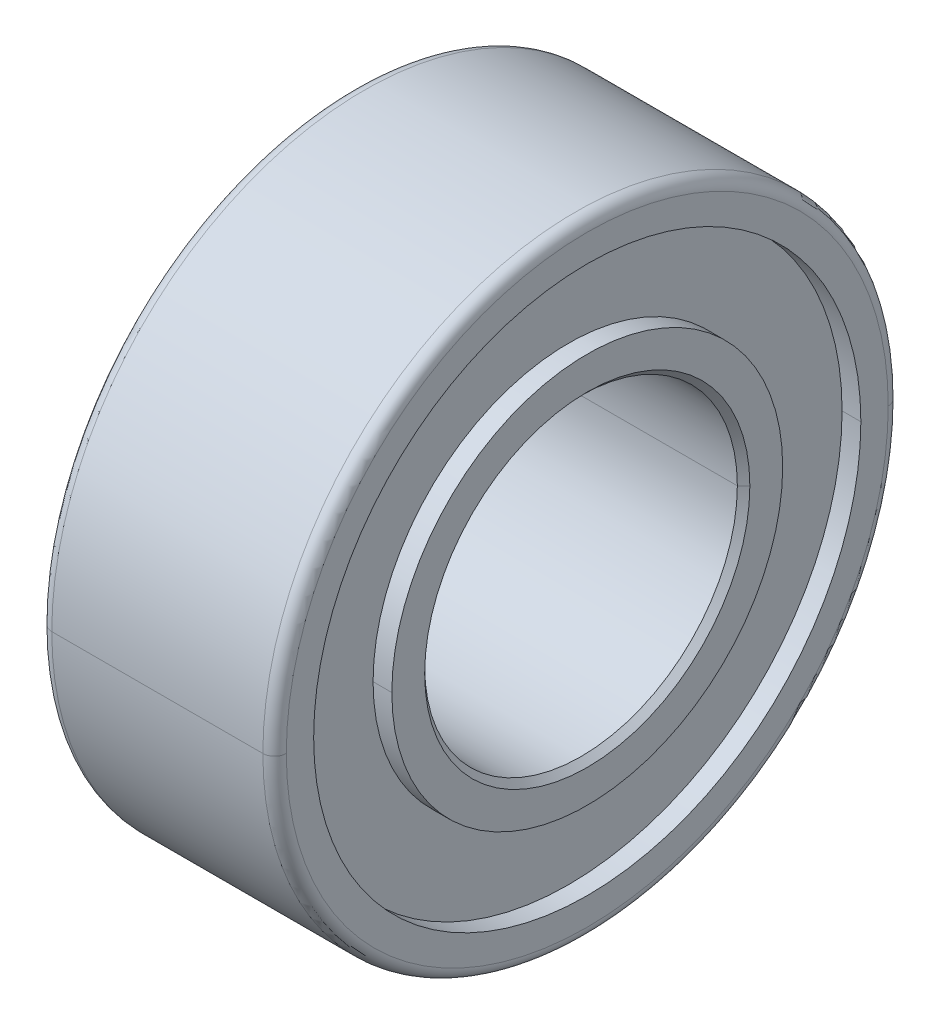
ISO-10303-21;
HEADER;
FILE_DESCRIPTION(('STEP AP214'),'2;1');
FILE_NAME('part.step','',(''),(''),'','','');
FILE_SCHEMA(('AUTOMOTIVE_DESIGN { 1 0 10303 214 1 1 1 1 }'));
ENDSEC;
DATA;
#1=APPLICATION_CONTEXT('core data for automotive mechanical design processes');
#2=APPLICATION_PROTOCOL_DEFINITION('international standard','automotive_design',2000,#1);
#3=PRODUCT_CONTEXT('',#1,'mechanical');
#4=PRODUCT('Part','Part','',(#3));
#5=PRODUCT_RELATED_PRODUCT_CATEGORY('part','',(#4));
#6=PRODUCT_DEFINITION_FORMATION('','',#4);
#7=PRODUCT_DEFINITION_CONTEXT('part definition',#1,'design');
#8=PRODUCT_DEFINITION('design','',#6,#7);
#9=PRODUCT_DEFINITION_SHAPE('','',#8);
#10=(LENGTH_UNIT() NAMED_UNIT(*) SI_UNIT(.MILLI.,.METRE.));
#11=(NAMED_UNIT(*) PLANE_ANGLE_UNIT() SI_UNIT($,.RADIAN.));
#12=(NAMED_UNIT(*) SI_UNIT($,.STERADIAN.) SOLID_ANGLE_UNIT());
#13=UNCERTAINTY_MEASURE_WITH_UNIT(LENGTH_MEASURE(1.E-05),#10,'distance_accuracy_value','');
#14=(GEOMETRIC_REPRESENTATION_CONTEXT(3) GLOBAL_UNCERTAINTY_ASSIGNED_CONTEXT((#13)) GLOBAL_UNIT_ASSIGNED_CONTEXT((#10,
#11,#12)) REPRESENTATION_CONTEXT('',''));
#15=CARTESIAN_POINT('',(0.,0.,0.));
#16=DIRECTION('',(0.,0.,1.));
#17=DIRECTION('',(1.,0.,0.));
#18=AXIS2_PLACEMENT_3D('',#15,#16,#17);
#19=CARTESIAN_POINT('',(2.38125,0.,0.));
#20=DIRECTION('',(1.,0.,0.));
#21=DIRECTION('',(0.,0.,-1.));
#22=AXIS2_PLACEMENT_3D('',#19,#20,#21);
#23=CONICAL_SURFACE('',#22,3.302,0.785398163397445);
#24=DIRECTION('',(0.70710678118655,0.,0.707106781186545));
#25=VECTOR('',#24,1.);
#26=CARTESIAN_POINT('',(2.38125,0.,3.302));
#27=LINE('',#26,#25);
#28=CARTESIAN_POINT('',(2.25425,0.,3.175));
#29=VERTEX_POINT('',#28);
#30=CARTESIAN_POINT('',(2.38125,0.,3.302));
#31=VERTEX_POINT('',#30);
#32=EDGE_CURVE('E371',#29,#31,#27,.T.);
#33=ORIENTED_EDGE('',*,*,#32,.F.);
#34=CARTESIAN_POINT('',(2.25425,0.,0.));
#35=DIRECTION('',(1.,0.,0.));
#36=DIRECTION('',(0.,0.,1.));
#37=AXIS2_PLACEMENT_3D('',#34,#35,#36);
#38=CIRCLE('',#37,3.175);
#39=CARTESIAN_POINT('',(2.25425,0.,-3.175));
#40=VERTEX_POINT('',#39);
#41=EDGE_CURVE('E183',#40,#29,#38,.T.);
#42=ORIENTED_EDGE('',*,*,#41,.F.);
#43=DIRECTION('',(0.70710678118655,0.,-0.707106781186545));
#44=VECTOR('',#43,1.);
#45=CARTESIAN_POINT('',(2.38125,0.,-3.302));
#46=LINE('',#45,#44);
#47=CARTESIAN_POINT('',(2.38125,0.,-3.302));
#48=VERTEX_POINT('',#47);
#49=EDGE_CURVE('E360',#40,#48,#46,.T.);
#50=ORIENTED_EDGE('',*,*,#49,.T.);
#51=CARTESIAN_POINT('',(2.38125,0.,0.));
#52=DIRECTION('',(-1.,0.,0.));
#53=DIRECTION('',(0.,0.,1.));
#54=AXIS2_PLACEMENT_3D('',#51,#52,#53);
#55=CIRCLE('',#54,3.302);
#56=EDGE_CURVE('E143',#31,#48,#55,.T.);
#57=ORIENTED_EDGE('',*,*,#56,.F.);
#58=EDGE_LOOP('',(#33,#42,#50,#57));
#59=FACE_BOUND('',#58,.T.);
#60=ADVANCED_FACE('F16',(#59),#23,.F.);
#61=CARTESIAN_POINT('',(-2.25425,0.,0.));
#62=DIRECTION('',(-1.,0.,0.));
#63=DIRECTION('',(0.,0.,1.));
#64=AXIS2_PLACEMENT_3D('',#61,#62,#63);
#65=CONICAL_SURFACE('',#64,3.175,0.785398163397446);
#66=DIRECTION('',(-0.707106781186549,0.,-0.707106781186546));
#67=VECTOR('',#66,1.);
#68=CARTESIAN_POINT('',(-2.25425,0.,-3.175));
#69=LINE('',#68,#67);
#70=CARTESIAN_POINT('',(-2.25425,0.,-3.175));
#71=VERTEX_POINT('',#70);
#72=CARTESIAN_POINT('',(-2.38125,0.,-3.302));
#73=VERTEX_POINT('',#72);
#74=EDGE_CURVE('E350',#71,#73,#69,.T.);
#75=ORIENTED_EDGE('',*,*,#74,.F.);
#76=CARTESIAN_POINT('',(-2.25425,0.,0.));
#77=DIRECTION('',(-1.,0.,0.));
#78=DIRECTION('',(0.,0.,-1.));
#79=AXIS2_PLACEMENT_3D('',#76,#77,#78);
#80=CIRCLE('',#79,3.175);
#81=CARTESIAN_POINT('',(-2.25425,0.,3.175));
#82=VERTEX_POINT('',#81);
#83=EDGE_CURVE('E144',#82,#71,#80,.T.);
#84=ORIENTED_EDGE('',*,*,#83,.F.);
#85=DIRECTION('',(-0.707106781186549,0.,0.707106781186546));
#86=VECTOR('',#85,1.);
#87=CARTESIAN_POINT('',(-2.25425,0.,3.175));
#88=LINE('',#87,#86);
#89=CARTESIAN_POINT('',(-2.38125,0.,3.302));
#90=VERTEX_POINT('',#89);
#91=EDGE_CURVE('E311',#82,#90,#88,.T.);
#92=ORIENTED_EDGE('',*,*,#91,.T.);
#93=CARTESIAN_POINT('',(-2.38125,0.,0.));
#94=DIRECTION('',(1.,0.,0.));
#95=DIRECTION('',(0.,0.,-1.));
#96=AXIS2_PLACEMENT_3D('',#93,#94,#95);
#97=CIRCLE('',#96,3.302);
#98=EDGE_CURVE('E187',#73,#90,#97,.T.);
#99=ORIENTED_EDGE('',*,*,#98,.F.);
#100=EDGE_LOOP('',(#75,#84,#92,#99));
#101=FACE_BOUND('',#100,.T.);
#102=ADVANCED_FACE('F443',(#101),#65,.F.);
#103=CARTESIAN_POINT('',(2.143125,0.,0.));
#104=DIRECTION('',(-1.,0.,0.));
#105=DIRECTION('',(0.,0.,1.));
#106=AXIS2_PLACEMENT_3D('',#103,#104,#105);
#107=TOROIDAL_SURFACE('',#106,6.111875,0.238125);
#108=CARTESIAN_POINT('',(2.143125,0.,-6.111875));
#109=DIRECTION('',(0.,1.,0.));
#110=DIRECTION('',(0.,0.,1.));
#111=AXIS2_PLACEMENT_3D('',#108,#109,#110);
#112=CIRCLE('',#111,0.238125);
#113=CARTESIAN_POINT('',(2.38125,0.,-6.111875));
#114=VERTEX_POINT('',#113);
#115=CARTESIAN_POINT('',(2.143125,0.,-6.35));
#116=VERTEX_POINT('',#115);
#117=EDGE_CURVE('E300',#114,#116,#112,.T.);
#118=ORIENTED_EDGE('',*,*,#117,.F.);
#119=CARTESIAN_POINT('',(2.38125,0.,0.));
#120=DIRECTION('',(1.,0.,0.));
#121=DIRECTION('',(0.,0.,1.));
#122=AXIS2_PLACEMENT_3D('',#119,#120,#121);
#123=CIRCLE('',#122,6.111875);
#124=CARTESIAN_POINT('',(2.38125,0.,6.111875));
#125=VERTEX_POINT('',#124);
#126=EDGE_CURVE('E197',#125,#114,#123,.T.);
#127=ORIENTED_EDGE('',*,*,#126,.F.);
#128=CARTESIAN_POINT('',(2.143125,0.,6.111875));
#129=DIRECTION('',(0.,-1.,0.));
#130=DIRECTION('',(0.,0.,-1.));
#131=AXIS2_PLACEMENT_3D('',#128,#129,#130);
#132=CIRCLE('',#131,0.238125);
#133=CARTESIAN_POINT('',(2.143125,0.,6.35));
#134=VERTEX_POINT('',#133);
#135=EDGE_CURVE('E309',#125,#134,#132,.T.);
#136=ORIENTED_EDGE('',*,*,#135,.T.);
#137=CARTESIAN_POINT('',(2.143125,0.,0.));
#138=DIRECTION('',(-1.,0.,0.));
#139=DIRECTION('',(0.,0.,1.));
#140=AXIS2_PLACEMENT_3D('',#137,#138,#139);
#141=CIRCLE('',#140,6.35);
#142=EDGE_CURVE('E201',#116,#134,#141,.T.);
#143=ORIENTED_EDGE('',*,*,#142,.F.);
#144=EDGE_LOOP('',(#118,#127,#136,#143));
#145=FACE_BOUND('',#144,.T.);
#146=ADVANCED_FACE('F301',(#145),#107,.T.);
#147=CARTESIAN_POINT('',(-2.143125,0.,0.));
#148=DIRECTION('',(1.,0.,0.));
#149=DIRECTION('',(0.,0.,-1.));
#150=AXIS2_PLACEMENT_3D('',#147,#148,#149);
#151=TOROIDAL_SURFACE('',#150,6.111875,0.238125);
#152=CARTESIAN_POINT('',(-2.143125,0.,6.111875));
#153=DIRECTION('',(0.,1.,0.));
#154=DIRECTION('',(0.,0.,1.));
#155=AXIS2_PLACEMENT_3D('',#152,#153,#154);
#156=CIRCLE('',#155,0.238125);
#157=CARTESIAN_POINT('',(-2.38125,0.,6.111875));
#158=VERTEX_POINT('',#157);
#159=CARTESIAN_POINT('',(-2.143125,0.,6.35));
#160=VERTEX_POINT('',#159);
#161=EDGE_CURVE('E325',#158,#160,#156,.T.);
#162=ORIENTED_EDGE('',*,*,#161,.F.);
#163=CARTESIAN_POINT('',(-2.38125,0.,0.));
#164=DIRECTION('',(-1.,0.,0.));
#165=DIRECTION('',(0.,0.,-1.));
#166=AXIS2_PLACEMENT_3D('',#163,#164,#165);
#167=CIRCLE('',#166,6.111875);
#168=CARTESIAN_POINT('',(-2.38125,0.,-6.111875));
#169=VERTEX_POINT('',#168);
#170=EDGE_CURVE('E207',#169,#158,#167,.T.);
#171=ORIENTED_EDGE('',*,*,#170,.F.);
#172=CARTESIAN_POINT('',(-2.143125,0.,-6.111875));
#173=DIRECTION('',(0.,-1.,0.));
#174=DIRECTION('',(0.,0.,-1.));
#175=AXIS2_PLACEMENT_3D('',#172,#173,#174);
#176=CIRCLE('',#175,0.238125);
#177=CARTESIAN_POINT('',(-2.143125,0.,-6.35));
#178=VERTEX_POINT('',#177);
#179=EDGE_CURVE('E324',#169,#178,#176,.T.);
#180=ORIENTED_EDGE('',*,*,#179,.T.);
#181=CARTESIAN_POINT('',(-2.143125,0.,0.));
#182=DIRECTION('',(1.,0.,0.));
#183=DIRECTION('',(0.,0.,-1.));
#184=AXIS2_PLACEMENT_3D('',#181,#182,#183);
#185=CIRCLE('',#184,6.35);
#186=EDGE_CURVE('E204',#160,#178,#185,.T.);
#187=ORIENTED_EDGE('',*,*,#186,.F.);
#188=EDGE_LOOP('',(#162,#171,#180,#187));
#189=FACE_BOUND('',#188,.T.);
#190=ADVANCED_FACE('F465',(#189),#151,.T.);
#191=CARTESIAN_POINT('',(0.,0.,0.));
#192=DIRECTION('',(-1.,0.,0.));
#193=DIRECTION('',(0.,0.,1.));
#194=AXIS2_PLACEMENT_3D('',#191,#192,#193);
#195=CYLINDRICAL_SURFACE('',#194,3.96875);
#196=DIRECTION('',(-1.,0.,0.));
#197=VECTOR('',#196,1.);
#198=CARTESIAN_POINT('',(0.,0.,-3.96875));
#199=LINE('',#198,#197);
#200=CARTESIAN_POINT('',(-2.00025,0.,-3.96875));
#201=VERTEX_POINT('',#200);
#202=CARTESIAN_POINT('',(-2.38125,0.,-3.96875));
#203=VERTEX_POINT('',#202);
#204=EDGE_CURVE('E329',#201,#203,#199,.T.);
#205=ORIENTED_EDGE('',*,*,#204,.F.);
#206=CARTESIAN_POINT('',(-2.00025,0.,0.));
#207=DIRECTION('',(-1.,0.,0.));
#208=DIRECTION('',(0.,0.,1.));
#209=AXIS2_PLACEMENT_3D('',#206,#207,#208);
#210=CIRCLE('',#209,3.96875);
#211=CARTESIAN_POINT('',(-2.00025,0.,3.96875));
#212=VERTEX_POINT('',#211);
#213=EDGE_CURVE('E11',#201,#212,#210,.T.);
#214=ORIENTED_EDGE('',*,*,#213,.T.);
#215=DIRECTION('',(-1.,0.,0.));
#216=VECTOR('',#215,1.);
#217=CARTESIAN_POINT('',(0.,0.,3.96875));
#218=LINE('',#217,#216);
#219=CARTESIAN_POINT('',(-2.38125,0.,3.96875));
#220=VERTEX_POINT('',#219);
#221=EDGE_CURVE('E236',#212,#220,#218,.T.);
#222=ORIENTED_EDGE('',*,*,#221,.T.);
#223=CARTESIAN_POINT('',(-2.38125,0.,0.));
#224=DIRECTION('',(-1.,0.,0.));
#225=DIRECTION('',(0.,0.,1.));
#226=AXIS2_PLACEMENT_3D('',#223,#224,#225);
#227=CIRCLE('',#226,3.96875);
#228=EDGE_CURVE('E182',#203,#220,#227,.T.);
#229=ORIENTED_EDGE('',*,*,#228,.F.);
#230=EDGE_LOOP('',(#205,#214,#222,#229));
#231=FACE_BOUND('',#230,.T.);
#232=ADVANCED_FACE('F455',(#231),#195,.T.);
#233=CARTESIAN_POINT('',(-2.00025,5.55625,0.));
#234=DIRECTION('',(1.,0.,0.));
#235=DIRECTION('',(0.,1.,0.));
#236=AXIS2_PLACEMENT_3D('',#233,#234,#235);
#237=PLANE('',#236);
#238=CARTESIAN_POINT('',(-2.00025,0.,0.));
#239=DIRECTION('',(-1.,0.,0.));
#240=DIRECTION('',(0.,0.,1.));
#241=AXIS2_PLACEMENT_3D('',#238,#239,#240);
#242=CIRCLE('',#241,3.96875);
#243=EDGE_CURVE('E326',#212,#201,#242,.T.);
#244=ORIENTED_EDGE('',*,*,#243,.F.);
#245=ORIENTED_EDGE('',*,*,#213,.F.);
#246=EDGE_LOOP('',(#244,#245));
#247=FACE_BOUND('',#246,.T.);
#248=CARTESIAN_POINT('',(-2.00025,0.,0.));
#249=DIRECTION('',(-1.,0.,0.));
#250=DIRECTION('',(0.,0.,1.));
#251=AXIS2_PLACEMENT_3D('',#248,#249,#250);
#252=CIRCLE('',#251,5.55625);
#253=CARTESIAN_POINT('',(-2.00025,0.,5.55625));
#254=VERTEX_POINT('',#253);
#255=CARTESIAN_POINT('',(-2.00025,0.,-5.55625));
#256=VERTEX_POINT('',#255);
#257=EDGE_CURVE('E25',#254,#256,#252,.T.);
#258=ORIENTED_EDGE('',*,*,#257,.T.);
#259=CARTESIAN_POINT('',(-2.00025,0.,0.));
#260=DIRECTION('',(-1.,0.,0.));
#261=DIRECTION('',(0.,0.,1.));
#262=AXIS2_PLACEMENT_3D('',#259,#260,#261);
#263=CIRCLE('',#262,5.55625);
#264=EDGE_CURVE('E220',#256,#254,#263,.T.);
#265=ORIENTED_EDGE('',*,*,#264,.T.);
#266=EDGE_LOOP('',(#258,#265));
#267=FACE_BOUND('',#266,.T.);
#268=ADVANCED_FACE('F218',(#247,#267),#237,.F.);
#269=CARTESIAN_POINT('',(0.,0.,0.));
#270=DIRECTION('',(-1.,0.,0.));
#271=DIRECTION('',(0.,0.,1.));
#272=AXIS2_PLACEMENT_3D('',#269,#270,#271);
#273=CYLINDRICAL_SURFACE('',#272,5.55625);
#274=DIRECTION('',(-1.,0.,0.));
#275=VECTOR('',#274,1.);
#276=CARTESIAN_POINT('',(0.,0.,-5.55625));
#277=LINE('',#276,#275);
#278=CARTESIAN_POINT('',(-2.38125,0.,-5.55625));
#279=VERTEX_POINT('',#278);
#280=EDGE_CURVE('E225',#256,#279,#277,.T.);
#281=ORIENTED_EDGE('',*,*,#280,.F.);
#282=ORIENTED_EDGE('',*,*,#257,.F.);
#283=DIRECTION('',(-1.,0.,0.));
#284=VECTOR('',#283,1.);
#285=CARTESIAN_POINT('',(0.,0.,5.55625));
#286=LINE('',#285,#284);
#287=CARTESIAN_POINT('',(-2.38125,0.,5.55625));
#288=VERTEX_POINT('',#287);
#289=EDGE_CURVE('E234',#254,#288,#286,.T.);
#290=ORIENTED_EDGE('',*,*,#289,.T.);
#291=CARTESIAN_POINT('',(-2.38125,0.,0.));
#292=DIRECTION('',(-1.,0.,0.));
#293=DIRECTION('',(0.,0.,1.));
#294=AXIS2_PLACEMENT_3D('',#291,#292,#293);
#295=CIRCLE('',#294,5.55625);
#296=EDGE_CURVE('E210',#288,#279,#295,.T.);
#297=ORIENTED_EDGE('',*,*,#296,.T.);
#298=EDGE_LOOP('',(#281,#282,#290,#297));
#299=FACE_BOUND('',#298,.T.);
#300=ADVANCED_FACE('F226',(#299),#273,.F.);
#301=CARTESIAN_POINT('',(-2.38125,6.35,0.));
#302=DIRECTION('',(1.,0.,0.));
#303=DIRECTION('',(0.,1.,0.));
#304=AXIS2_PLACEMENT_3D('',#301,#302,#303);
#305=PLANE('',#304);
#306=ORIENTED_EDGE('',*,*,#296,.F.);
#307=CARTESIAN_POINT('',(-2.38125,0.,0.));
#308=DIRECTION('',(-1.,0.,0.));
#309=DIRECTION('',(0.,0.,1.));
#310=AXIS2_PLACEMENT_3D('',#307,#308,#309);
#311=CIRCLE('',#310,5.55625);
#312=EDGE_CURVE('E231',#279,#288,#311,.T.);
#313=ORIENTED_EDGE('',*,*,#312,.F.);
#314=EDGE_LOOP('',(#306,#313));
#315=FACE_BOUND('',#314,.T.);
#316=ORIENTED_EDGE('',*,*,#170,.T.);
#317=CARTESIAN_POINT('',(-2.38125,0.,0.));
#318=DIRECTION('',(-1.,0.,0.));
#319=DIRECTION('',(0.,0.,-1.));
#320=AXIS2_PLACEMENT_3D('',#317,#318,#319);
#321=CIRCLE('',#320,6.111875);
#322=EDGE_CURVE('E368',#158,#169,#321,.T.);
#323=ORIENTED_EDGE('',*,*,#322,.T.);
#324=EDGE_LOOP('',(#316,#323));
#325=FACE_BOUND('',#324,.T.);
#326=ADVANCED_FACE('F393',(#315,#325),#305,.F.);
#327=CARTESIAN_POINT('',(0.,0.,0.));
#328=DIRECTION('',(-1.,0.,0.));
#329=DIRECTION('',(0.,0.,1.));
#330=AXIS2_PLACEMENT_3D('',#327,#328,#329);
#331=CYLINDRICAL_SURFACE('',#330,6.35);
#332=DIRECTION('',(-1.,0.,0.));
#333=VECTOR('',#332,1.);
#334=CARTESIAN_POINT('',(0.,0.,-6.35));
#335=LINE('',#334,#333);
#336=EDGE_CURVE('E251',#116,#178,#335,.T.);
#337=ORIENTED_EDGE('',*,*,#336,.F.);
#338=ORIENTED_EDGE('',*,*,#142,.T.);
#339=DIRECTION('',(-1.,0.,0.));
#340=VECTOR('',#339,1.);
#341=CARTESIAN_POINT('',(0.,0.,6.35));
#342=LINE('',#341,#340);
#343=EDGE_CURVE('E255',#134,#160,#342,.T.);
#344=ORIENTED_EDGE('',*,*,#343,.T.);
#345=ORIENTED_EDGE('',*,*,#186,.T.);
#346=EDGE_LOOP('',(#337,#338,#344,#345));
#347=FACE_BOUND('',#346,.T.);
#348=ADVANCED_FACE('F287',(#347),#331,.T.);
#349=CARTESIAN_POINT('',(2.38125,5.55625,0.));
#350=DIRECTION('',(-1.,0.,0.));
#351=DIRECTION('',(0.,0.,1.));
#352=AXIS2_PLACEMENT_3D('',#349,#350,#351);
#353=PLANE('',#352);
#354=CARTESIAN_POINT('',(2.38125,0.,0.));
#355=DIRECTION('',(-1.,0.,0.));
#356=DIRECTION('',(0.,0.,1.));
#357=AXIS2_PLACEMENT_3D('',#354,#355,#356);
#358=CIRCLE('',#357,5.55625);
#359=CARTESIAN_POINT('',(2.38125,0.,5.55625));
#360=VERTEX_POINT('',#359);
#361=CARTESIAN_POINT('',(2.38125,0.,-5.55625));
#362=VERTEX_POINT('',#361);
#363=EDGE_CURVE('E194',#360,#362,#358,.T.);
#364=ORIENTED_EDGE('',*,*,#363,.T.);
#365=CARTESIAN_POINT('',(2.38125,0.,0.));
#366=DIRECTION('',(-1.,0.,0.));
#367=DIRECTION('',(0.,0.,1.));
#368=AXIS2_PLACEMENT_3D('',#365,#366,#367);
#369=CIRCLE('',#368,5.55625);
#370=EDGE_CURVE('E259',#362,#360,#369,.T.);
#371=ORIENTED_EDGE('',*,*,#370,.T.);
#372=EDGE_LOOP('',(#364,#371));
#373=FACE_BOUND('',#372,.T.);
#374=ORIENTED_EDGE('',*,*,#126,.T.);
#375=CARTESIAN_POINT('',(2.38125,0.,0.));
#376=DIRECTION('',(1.,0.,0.));
#377=DIRECTION('',(0.,0.,1.));
#378=AXIS2_PLACEMENT_3D('',#375,#376,#377);
#379=CIRCLE('',#378,6.111875);
#380=EDGE_CURVE('E293',#114,#125,#379,.T.);
#381=ORIENTED_EDGE('',*,*,#380,.T.);
#382=EDGE_LOOP('',(#374,#381));
#383=FACE_BOUND('',#382,.T.);
#384=ADVANCED_FACE('F284',(#373,#383),#353,.F.);
#385=CARTESIAN_POINT('',(0.,0.,0.));
#386=DIRECTION('',(-1.,0.,0.));
#387=DIRECTION('',(0.,0.,1.));
#388=AXIS2_PLACEMENT_3D('',#385,#386,#387);
#389=CYLINDRICAL_SURFACE('',#388,5.55625);
#390=DIRECTION('',(-1.,0.,0.));
#391=VECTOR('',#390,1.);
#392=CARTESIAN_POINT('',(0.,0.,-5.55625));
#393=LINE('',#392,#391);
#394=CARTESIAN_POINT('',(2.00025,0.,-5.55625));
#395=VERTEX_POINT('',#394);
#396=EDGE_CURVE('E265',#362,#395,#393,.T.);
#397=ORIENTED_EDGE('',*,*,#396,.F.);
#398=ORIENTED_EDGE('',*,*,#363,.F.);
#399=DIRECTION('',(-1.,0.,0.));
#400=VECTOR('',#399,1.);
#401=CARTESIAN_POINT('',(0.,0.,5.55625));
#402=LINE('',#401,#400);
#403=CARTESIAN_POINT('',(2.00025,0.,5.55625));
#404=VERTEX_POINT('',#403);
#405=EDGE_CURVE('E157',#360,#404,#402,.T.);
#406=ORIENTED_EDGE('',*,*,#405,.T.);
#407=CARTESIAN_POINT('',(2.00025,0.,0.));
#408=DIRECTION('',(-1.,0.,0.));
#409=DIRECTION('',(0.,0.,1.));
#410=AXIS2_PLACEMENT_3D('',#407,#408,#409);
#411=CIRCLE('',#410,5.55625);
#412=EDGE_CURVE('E191',#404,#395,#411,.T.);
#413=ORIENTED_EDGE('',*,*,#412,.T.);
#414=EDGE_LOOP('',(#397,#398,#406,#413));
#415=FACE_BOUND('',#414,.T.);
#416=ADVANCED_FACE('F282',(#415),#389,.F.);
#417=CARTESIAN_POINT('',(2.00025,3.96875,0.));
#418=DIRECTION('',(-1.,0.,0.));
#419=DIRECTION('',(0.,0.,1.));
#420=AXIS2_PLACEMENT_3D('',#417,#418,#419);
#421=PLANE('',#420);
#422=CARTESIAN_POINT('',(2.00025,0.,0.));
#423=DIRECTION('',(-1.,0.,0.));
#424=DIRECTION('',(0.,0.,1.));
#425=AXIS2_PLACEMENT_3D('',#422,#423,#424);
#426=CIRCLE('',#425,3.96875);
#427=CARTESIAN_POINT('',(2.00025,0.,3.96875));
#428=VERTEX_POINT('',#427);
#429=CARTESIAN_POINT('',(2.00025,0.,-3.96875));
#430=VERTEX_POINT('',#429);
#431=EDGE_CURVE('E152',#428,#430,#426,.T.);
#432=ORIENTED_EDGE('',*,*,#431,.T.);
#433=CARTESIAN_POINT('',(2.00025,0.,0.));
#434=DIRECTION('',(-1.,0.,0.));
#435=DIRECTION('',(0.,0.,1.));
#436=AXIS2_PLACEMENT_3D('',#433,#434,#435);
#437=CIRCLE('',#436,3.96875);
#438=EDGE_CURVE('E37',#430,#428,#437,.T.);
#439=ORIENTED_EDGE('',*,*,#438,.T.);
#440=EDGE_LOOP('',(#432,#439));
#441=FACE_BOUND('',#440,.T.);
#442=ORIENTED_EDGE('',*,*,#412,.F.);
#443=CARTESIAN_POINT('',(2.00025,0.,0.));
#444=DIRECTION('',(-1.,0.,0.));
#445=DIRECTION('',(0.,0.,1.));
#446=AXIS2_PLACEMENT_3D('',#443,#444,#445);
#447=CIRCLE('',#446,5.55625);
#448=EDGE_CURVE('E164',#395,#404,#447,.T.);
#449=ORIENTED_EDGE('',*,*,#448,.F.);
#450=EDGE_LOOP('',(#442,#449));
#451=FACE_BOUND('',#450,.T.);
#452=ADVANCED_FACE('F280',(#441,#451),#421,.F.);
#453=CARTESIAN_POINT('',(0.,0.,0.));
#454=DIRECTION('',(-1.,0.,0.));
#455=DIRECTION('',(0.,0.,1.));
#456=AXIS2_PLACEMENT_3D('',#453,#454,#455);
#457=CYLINDRICAL_SURFACE('',#456,3.96875);
#458=DIRECTION('',(-1.,0.,0.));
#459=VECTOR('',#458,1.);
#460=CARTESIAN_POINT('',(0.,0.,-3.96875));
#461=LINE('',#460,#459);
#462=CARTESIAN_POINT('',(2.38125,0.,-3.96875));
#463=VERTEX_POINT('',#462);
#464=EDGE_CURVE('E147',#463,#430,#461,.T.);
#465=ORIENTED_EDGE('',*,*,#464,.F.);
#466=CARTESIAN_POINT('',(2.38125,0.,0.));
#467=DIRECTION('',(-1.,0.,0.));
#468=DIRECTION('',(0.,0.,1.));
#469=AXIS2_PLACEMENT_3D('',#466,#467,#468);
#470=CIRCLE('',#469,3.96875);
#471=CARTESIAN_POINT('',(2.38125,0.,3.96875));
#472=VERTEX_POINT('',#471);
#473=EDGE_CURVE('E135',#463,#472,#470,.T.);
#474=ORIENTED_EDGE('',*,*,#473,.T.);
#475=DIRECTION('',(-1.,0.,0.));
#476=VECTOR('',#475,1.);
#477=CARTESIAN_POINT('',(0.,0.,3.96875));
#478=LINE('',#477,#476);
#479=EDGE_CURVE('E155',#472,#428,#478,.T.);
#480=ORIENTED_EDGE('',*,*,#479,.T.);
#481=ORIENTED_EDGE('',*,*,#438,.F.);
#482=EDGE_LOOP('',(#465,#474,#480,#481));
#483=FACE_BOUND('',#482,.T.);
#484=ADVANCED_FACE('F148',(#483),#457,.T.);
#485=CARTESIAN_POINT('',(2.38125,3.175,0.));
#486=DIRECTION('',(-1.,0.,0.));
#487=DIRECTION('',(0.,0.,1.));
#488=AXIS2_PLACEMENT_3D('',#485,#486,#487);
#489=PLANE('',#488);
#490=CARTESIAN_POINT('',(2.38125,0.,0.));
#491=DIRECTION('',(-1.,0.,0.));
#492=DIRECTION('',(0.,0.,1.));
#493=AXIS2_PLACEMENT_3D('',#490,#491,#492);
#494=CIRCLE('',#493,3.302);
#495=EDGE_CURVE('E364',#48,#31,#494,.T.);
#496=ORIENTED_EDGE('',*,*,#495,.T.);
#497=ORIENTED_EDGE('',*,*,#56,.T.);
#498=EDGE_LOOP('',(#496,#497));
#499=FACE_BOUND('',#498,.T.);
#500=CARTESIAN_POINT('',(2.38125,0.,0.));
#501=DIRECTION('',(-1.,0.,0.));
#502=DIRECTION('',(0.,0.,1.));
#503=AXIS2_PLACEMENT_3D('',#500,#501,#502);
#504=CIRCLE('',#503,3.96875);
#505=EDGE_CURVE('E139',#472,#463,#504,.T.);
#506=ORIENTED_EDGE('',*,*,#505,.F.);
#507=ORIENTED_EDGE('',*,*,#473,.F.);
#508=EDGE_LOOP('',(#506,#507));
#509=FACE_BOUND('',#508,.T.);
#510=ADVANCED_FACE('F137',(#499,#509),#489,.F.);
#511=CARTESIAN_POINT('',(0.,0.,0.));
#512=DIRECTION('',(-1.,0.,0.));
#513=DIRECTION('',(0.,0.,1.));
#514=AXIS2_PLACEMENT_3D('',#511,#512,#513);
#515=CYLINDRICAL_SURFACE('',#514,3.175);
#516=DIRECTION('',(-1.,0.,0.));
#517=VECTOR('',#516,1.);
#518=CARTESIAN_POINT('',(0.,0.,-3.175));
#519=LINE('',#518,#517);
#520=EDGE_CURVE('E171',#40,#71,#519,.T.);
#521=ORIENTED_EDGE('',*,*,#520,.F.);
#522=ORIENTED_EDGE('',*,*,#41,.T.);
#523=DIRECTION('',(-1.,0.,0.));
#524=VECTOR('',#523,1.);
#525=CARTESIAN_POINT('',(0.,0.,3.175));
#526=LINE('',#525,#524);
#527=EDGE_CURVE('E178',#29,#82,#526,.T.);
#528=ORIENTED_EDGE('',*,*,#527,.T.);
#529=ORIENTED_EDGE('',*,*,#83,.T.);
#530=EDGE_LOOP('',(#521,#522,#528,#529));
#531=FACE_BOUND('',#530,.T.);
#532=ADVANCED_FACE('F438',(#531),#515,.F.);
#533=CARTESIAN_POINT('',(-2.38125,3.96875,0.));
#534=DIRECTION('',(1.,0.,0.));
#535=DIRECTION('',(0.,1.,0.));
#536=AXIS2_PLACEMENT_3D('',#533,#534,#535);
#537=PLANE('',#536);
#538=CARTESIAN_POINT('',(-2.38125,0.,0.));
#539=DIRECTION('',(1.,0.,0.));
#540=DIRECTION('',(0.,0.,-1.));
#541=AXIS2_PLACEMENT_3D('',#538,#539,#540);
#542=CIRCLE('',#541,3.302);
#543=EDGE_CURVE('E317',#90,#73,#542,.T.);
#544=ORIENTED_EDGE('',*,*,#543,.T.);
#545=ORIENTED_EDGE('',*,*,#98,.T.);
#546=EDGE_LOOP('',(#544,#545));
#547=FACE_BOUND('',#546,.T.);
#548=CARTESIAN_POINT('',(-2.38125,0.,0.));
#549=DIRECTION('',(-1.,0.,0.));
#550=DIRECTION('',(0.,0.,1.));
#551=AXIS2_PLACEMENT_3D('',#548,#549,#550);
#552=CIRCLE('',#551,3.96875);
#553=EDGE_CURVE('E242',#220,#203,#552,.T.);
#554=ORIENTED_EDGE('',*,*,#553,.T.);
#555=ORIENTED_EDGE('',*,*,#228,.T.);
#556=EDGE_LOOP('',(#554,#555));
#557=FACE_BOUND('',#556,.T.);
#558=ADVANCED_FACE('F445',(#547,#557),#537,.F.);
#559=CARTESIAN_POINT('',(0.,0.,0.));
#560=DIRECTION('',(-1.,0.,0.));
#561=DIRECTION('',(0.,0.,1.));
#562=AXIS2_PLACEMENT_3D('',#559,#560,#561);
#563=CYLINDRICAL_SURFACE('',#562,3.175);
#564=CARTESIAN_POINT('',(2.25425,0.,0.));
#565=DIRECTION('',(1.,0.,0.));
#566=DIRECTION('',(0.,0.,1.));
#567=AXIS2_PLACEMENT_3D('',#564,#565,#566);
#568=CIRCLE('',#567,3.175);
#569=EDGE_CURVE('E376',#29,#40,#568,.T.);
#570=ORIENTED_EDGE('',*,*,#569,.T.);
#571=ORIENTED_EDGE('',*,*,#520,.T.);
#572=CARTESIAN_POINT('',(-2.25425,0.,0.));
#573=DIRECTION('',(-1.,0.,0.));
#574=DIRECTION('',(0.,0.,-1.));
#575=AXIS2_PLACEMENT_3D('',#572,#573,#574);
#576=CIRCLE('',#575,3.175);
#577=EDGE_CURVE('E355',#71,#82,#576,.T.);
#578=ORIENTED_EDGE('',*,*,#577,.T.);
#579=ORIENTED_EDGE('',*,*,#527,.F.);
#580=EDGE_LOOP('',(#570,#571,#578,#579));
#581=FACE_BOUND('',#580,.T.);
#582=ADVANCED_FACE('F433',(#581),#563,.F.);
#583=CARTESIAN_POINT('',(0.,0.,0.));
#584=DIRECTION('',(-1.,0.,0.));
#585=DIRECTION('',(0.,0.,1.));
#586=AXIS2_PLACEMENT_3D('',#583,#584,#585);
#587=CYLINDRICAL_SURFACE('',#586,3.96875);
#588=ORIENTED_EDGE('',*,*,#505,.T.);
#589=ORIENTED_EDGE('',*,*,#464,.T.);
#590=ORIENTED_EDGE('',*,*,#431,.F.);
#591=ORIENTED_EDGE('',*,*,#479,.F.);
#592=EDGE_LOOP('',(#588,#589,#590,#591));
#593=FACE_BOUND('',#592,.T.);
#594=ADVANCED_FACE('F154',(#593),#587,.T.);
#595=CARTESIAN_POINT('',(0.,0.,0.));
#596=DIRECTION('',(-1.,0.,0.));
#597=DIRECTION('',(0.,0.,1.));
#598=AXIS2_PLACEMENT_3D('',#595,#596,#597);
#599=CYLINDRICAL_SURFACE('',#598,5.55625);
#600=ORIENTED_EDGE('',*,*,#370,.F.);
#601=ORIENTED_EDGE('',*,*,#396,.T.);
#602=ORIENTED_EDGE('',*,*,#448,.T.);
#603=ORIENTED_EDGE('',*,*,#405,.F.);
#604=EDGE_LOOP('',(#600,#601,#602,#603));
#605=FACE_BOUND('',#604,.T.);
#606=ADVANCED_FACE('F277',(#605),#599,.F.);
#607=CARTESIAN_POINT('',(0.,0.,0.));
#608=DIRECTION('',(-1.,0.,0.));
#609=DIRECTION('',(0.,0.,1.));
#610=AXIS2_PLACEMENT_3D('',#607,#608,#609);
#611=CYLINDRICAL_SURFACE('',#610,6.35);
#612=CARTESIAN_POINT('',(2.143125,0.,0.));
#613=DIRECTION('',(-1.,0.,0.));
#614=DIRECTION('',(0.,0.,1.));
#615=AXIS2_PLACEMENT_3D('',#612,#613,#614);
#616=CIRCLE('',#615,6.35);
#617=EDGE_CURVE('E306',#134,#116,#616,.T.);
#618=ORIENTED_EDGE('',*,*,#617,.T.);
#619=ORIENTED_EDGE('',*,*,#336,.T.);
#620=CARTESIAN_POINT('',(-2.143125,0.,0.));
#621=DIRECTION('',(1.,0.,0.));
#622=DIRECTION('',(0.,0.,-1.));
#623=AXIS2_PLACEMENT_3D('',#620,#621,#622);
#624=CIRCLE('',#623,6.35);
#625=EDGE_CURVE('E321',#178,#160,#624,.T.);
#626=ORIENTED_EDGE('',*,*,#625,.T.);
#627=ORIENTED_EDGE('',*,*,#343,.F.);
#628=EDGE_LOOP('',(#618,#619,#626,#627));
#629=FACE_BOUND('',#628,.T.);
#630=ADVANCED_FACE('F399',(#629),#611,.T.);
#631=CARTESIAN_POINT('',(0.,0.,0.));
#632=DIRECTION('',(-1.,0.,0.));
#633=DIRECTION('',(0.,0.,1.));
#634=AXIS2_PLACEMENT_3D('',#631,#632,#633);
#635=CYLINDRICAL_SURFACE('',#634,5.55625);
#636=ORIENTED_EDGE('',*,*,#264,.F.);
#637=ORIENTED_EDGE('',*,*,#280,.T.);
#638=ORIENTED_EDGE('',*,*,#312,.T.);
#639=ORIENTED_EDGE('',*,*,#289,.F.);
#640=EDGE_LOOP('',(#636,#637,#638,#639));
#641=FACE_BOUND('',#640,.T.);
#642=ADVANCED_FACE('F233',(#641),#635,.F.);
#643=CARTESIAN_POINT('',(0.,0.,0.));
#644=DIRECTION('',(-1.,0.,0.));
#645=DIRECTION('',(0.,0.,1.));
#646=AXIS2_PLACEMENT_3D('',#643,#644,#645);
#647=CYLINDRICAL_SURFACE('',#646,3.96875);
#648=ORIENTED_EDGE('',*,*,#243,.T.);
#649=ORIENTED_EDGE('',*,*,#204,.T.);
#650=ORIENTED_EDGE('',*,*,#553,.F.);
#651=ORIENTED_EDGE('',*,*,#221,.F.);
#652=EDGE_LOOP('',(#648,#649,#650,#651));
#653=FACE_BOUND('',#652,.T.);
#654=ADVANCED_FACE('F453',(#653),#647,.T.);
#655=CARTESIAN_POINT('',(-2.143125,0.,0.));
#656=DIRECTION('',(1.,0.,0.));
#657=DIRECTION('',(0.,0.,-1.));
#658=AXIS2_PLACEMENT_3D('',#655,#656,#657);
#659=TOROIDAL_SURFACE('',#658,6.111875,0.238125);
#660=ORIENTED_EDGE('',*,*,#322,.F.);
#661=ORIENTED_EDGE('',*,*,#161,.T.);
#662=ORIENTED_EDGE('',*,*,#625,.F.);
#663=ORIENTED_EDGE('',*,*,#179,.F.);
#664=EDGE_LOOP('',(#660,#661,#662,#663));
#665=FACE_BOUND('',#664,.T.);
#666=ADVANCED_FACE('F396',(#665),#659,.T.);
#667=CARTESIAN_POINT('',(2.143125,0.,0.));
#668=DIRECTION('',(-1.,0.,0.));
#669=DIRECTION('',(0.,0.,1.));
#670=AXIS2_PLACEMENT_3D('',#667,#668,#669);
#671=TOROIDAL_SURFACE('',#670,6.111875,0.238125);
#672=ORIENTED_EDGE('',*,*,#380,.F.);
#673=ORIENTED_EDGE('',*,*,#117,.T.);
#674=ORIENTED_EDGE('',*,*,#617,.F.);
#675=ORIENTED_EDGE('',*,*,#135,.F.);
#676=EDGE_LOOP('',(#672,#673,#674,#675));
#677=FACE_BOUND('',#676,.T.);
#678=ADVANCED_FACE('F308',(#677),#671,.T.);
#679=CARTESIAN_POINT('',(-2.25425,0.,0.));
#680=DIRECTION('',(-1.,0.,0.));
#681=DIRECTION('',(0.,0.,1.));
#682=AXIS2_PLACEMENT_3D('',#679,#680,#681);
#683=CONICAL_SURFACE('',#682,3.175,0.785398163397446);
#684=ORIENTED_EDGE('',*,*,#577,.F.);
#685=ORIENTED_EDGE('',*,*,#74,.T.);
#686=ORIENTED_EDGE('',*,*,#543,.F.);
#687=ORIENTED_EDGE('',*,*,#91,.F.);
#688=EDGE_LOOP('',(#684,#685,#686,#687));
#689=FACE_BOUND('',#688,.T.);
#690=ADVANCED_FACE('F441',(#689),#683,.F.);
#691=CARTESIAN_POINT('',(2.38125,0.,0.));
#692=DIRECTION('',(1.,0.,0.));
#693=DIRECTION('',(0.,0.,-1.));
#694=AXIS2_PLACEMENT_3D('',#691,#692,#693);
#695=CONICAL_SURFACE('',#694,3.302,0.785398163397445);
#696=ORIENTED_EDGE('',*,*,#569,.F.);
#697=ORIENTED_EDGE('',*,*,#32,.T.);
#698=ORIENTED_EDGE('',*,*,#495,.F.);
#699=ORIENTED_EDGE('',*,*,#49,.F.);
#700=EDGE_LOOP('',(#696,#697,#698,#699));
#701=FACE_BOUND('',#700,.T.);
#702=ADVANCED_FACE('F430',(#701),#695,.F.);
#703=CLOSED_SHELL('',(#60,#102,#146,#190,#232,#268,#300,#326,#348,#384,#416,#452,#484,#510,#532,
#558,#582,#594,#606,#630,#642,#654,#666,#678,#690,#702));
#704=MANIFOLD_SOLID_BREP('B1',#703);
#705=ADVANCED_BREP_SHAPE_REPRESENTATION('',(#18,#704),#14);
#706=SHAPE_DEFINITION_REPRESENTATION(#9,#705);
ENDSEC;
END-ISO-10303-21;
